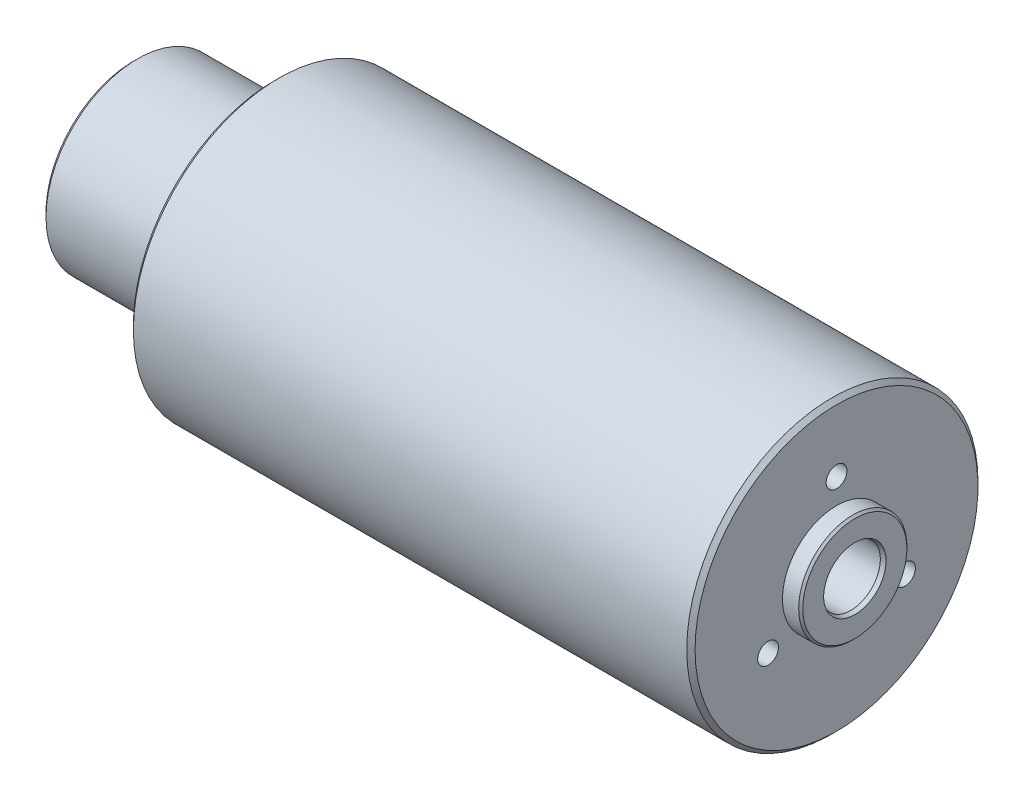
ISO-10303-21;
HEADER;
FILE_DESCRIPTION(('STEP AP214'),'2;1');
FILE_NAME('part.step','',(''),(''),'','','');
FILE_SCHEMA(('AUTOMOTIVE_DESIGN { 1 0 10303 214 1 1 1 1 }'));
ENDSEC;
DATA;
#1=APPLICATION_CONTEXT('core data for automotive mechanical design processes');
#2=APPLICATION_PROTOCOL_DEFINITION('international standard','automotive_design',2000,#1);
#3=PRODUCT_CONTEXT('',#1,'mechanical');
#4=PRODUCT('Part','Part','',(#3));
#5=PRODUCT_RELATED_PRODUCT_CATEGORY('part','',(#4));
#6=PRODUCT_DEFINITION_FORMATION('','',#4);
#7=PRODUCT_DEFINITION_CONTEXT('part definition',#1,'design');
#8=PRODUCT_DEFINITION('design','',#6,#7);
#9=PRODUCT_DEFINITION_SHAPE('','',#8);
#10=(LENGTH_UNIT() NAMED_UNIT(*) SI_UNIT(.MILLI.,.METRE.));
#11=(NAMED_UNIT(*) PLANE_ANGLE_UNIT() SI_UNIT($,.RADIAN.));
#12=(NAMED_UNIT(*) SI_UNIT($,.STERADIAN.) SOLID_ANGLE_UNIT());
#13=UNCERTAINTY_MEASURE_WITH_UNIT(LENGTH_MEASURE(1.E-05),#10,'distance_accuracy_value','');
#14=(GEOMETRIC_REPRESENTATION_CONTEXT(3) GLOBAL_UNCERTAINTY_ASSIGNED_CONTEXT((#13)) GLOBAL_UNIT_ASSIGNED_CONTEXT((#10,
#11,#12)) REPRESENTATION_CONTEXT('',''));
#15=CARTESIAN_POINT('',(0.,0.,0.));
#16=DIRECTION('',(0.,0.,1.));
#17=DIRECTION('',(1.,0.,0.));
#18=AXIS2_PLACEMENT_3D('',#15,#16,#17);
#19=CARTESIAN_POINT('',(-84.5007135035158,11.,0.));
#20=DIRECTION('',(1.,0.,0.));
#21=DIRECTION('',(0.,0.,-1.));
#22=AXIS2_PLACEMENT_3D('',#19,#20,#21);
#23=PLANE('',#22);
#24=CARTESIAN_POINT('',(-84.5007135035158,0.,0.));
#25=DIRECTION('',(1.,0.,0.));
#26=DIRECTION('',(0.,0.,-1.));
#27=AXIS2_PLACEMENT_3D('',#24,#25,#26);
#28=CIRCLE('',#27,10.5);
#29=CARTESIAN_POINT('',(-84.5007135035158,0.,-10.5));
#30=VERTEX_POINT('',#29);
#31=EDGE_CURVE('E117',#30,#30,#28,.F.);
#32=ORIENTED_EDGE('',*,*,#31,.T.);
#33=EDGE_LOOP('',(#32));
#34=FACE_BOUND('',#33,.T.);
#35=ADVANCED_FACE('F32',(#34),#23,.F.);
#36=CARTESIAN_POINT('',(-71.1251521298174,0.,0.));
#37=DIRECTION('',(-1.,0.,0.));
#38=DIRECTION('',(0.,0.,1.));
#39=AXIS2_PLACEMENT_3D('',#36,#37,#38);
#40=CYLINDRICAL_SURFACE('',#39,11.);
#41=CARTESIAN_POINT('',(-84.0007135035158,0.,0.));
#42=DIRECTION('',(1.,0.,0.));
#43=DIRECTION('',(0.,0.,-1.));
#44=AXIS2_PLACEMENT_3D('',#41,#42,#43);
#45=CIRCLE('',#44,11.);
#46=CARTESIAN_POINT('',(-84.0007135035158,0.,-11.));
#47=VERTEX_POINT('',#46);
#48=EDGE_CURVE('E120',#47,#47,#45,.T.);
#49=ORIENTED_EDGE('',*,*,#48,.T.);
#50=EDGE_LOOP('',(#49));
#51=FACE_BOUND('',#50,.T.);
#52=CARTESIAN_POINT('',(-67.5007135035158,0.,0.));
#53=DIRECTION('',(-1.,0.,0.));
#54=DIRECTION('',(0.,0.,1.));
#55=AXIS2_PLACEMENT_3D('',#52,#53,#54);
#56=CIRCLE('',#55,11.);
#57=CARTESIAN_POINT('',(-67.5007135035158,0.,11.));
#58=VERTEX_POINT('',#57);
#59=EDGE_CURVE('E108',#58,#58,#56,.T.);
#60=ORIENTED_EDGE('',*,*,#59,.T.);
#61=EDGE_LOOP('',(#60));
#62=FACE_BOUND('',#61,.T.);
#63=ADVANCED_FACE('F144',(#51,#62),#40,.T.);
#64=CARTESIAN_POINT('',(-67.5007135035158,17.5,0.));
#65=DIRECTION('',(1.,0.,0.));
#66=DIRECTION('',(0.,0.,-1.));
#67=AXIS2_PLACEMENT_3D('',#64,#65,#66);
#68=PLANE('',#67);
#69=CARTESIAN_POINT('',(-67.5007135035158,0.,0.));
#70=DIRECTION('',(1.,0.,0.));
#71=DIRECTION('',(0.,0.,-1.));
#72=AXIS2_PLACEMENT_3D('',#69,#70,#71);
#73=CIRCLE('',#72,17.);
#74=CARTESIAN_POINT('',(-67.5007135035158,0.,-17.));
#75=VERTEX_POINT('',#74);
#76=EDGE_CURVE('E123',#75,#75,#73,.F.);
#77=ORIENTED_EDGE('',*,*,#76,.T.);
#78=EDGE_LOOP('',(#77));
#79=FACE_BOUND('',#78,.T.);
#80=ORIENTED_EDGE('',*,*,#59,.F.);
#81=EDGE_LOOP('',(#80));
#82=FACE_BOUND('',#81,.T.);
#83=ADVANCED_FACE('F141',(#79,#82),#68,.F.);
#84=CARTESIAN_POINT('',(-71.1251521298174,0.,0.));
#85=DIRECTION('',(-1.,0.,0.));
#86=DIRECTION('',(0.,0.,1.));
#87=AXIS2_PLACEMENT_3D('',#84,#85,#86);
#88=CYLINDRICAL_SURFACE('',#87,17.5);
#89=CARTESIAN_POINT('',(-67.0007135035158,0.,0.));
#90=DIRECTION('',(1.,0.,0.));
#91=DIRECTION('',(0.,0.,-1.));
#92=AXIS2_PLACEMENT_3D('',#89,#90,#91);
#93=CIRCLE('',#92,17.5);
#94=CARTESIAN_POINT('',(-67.0007135035158,0.,-17.5));
#95=VERTEX_POINT('',#94);
#96=EDGE_CURVE('E39',#95,#95,#93,.T.);
#97=ORIENTED_EDGE('',*,*,#96,.T.);
#98=EDGE_LOOP('',(#97));
#99=FACE_BOUND('',#98,.T.);
#100=CARTESIAN_POINT('',(-0.5,0.,0.));
#101=DIRECTION('',(-1.,0.,0.));
#102=DIRECTION('',(0.,0.,1.));
#103=AXIS2_PLACEMENT_3D('',#100,#101,#102);
#104=CIRCLE('',#103,17.5);
#105=CARTESIAN_POINT('',(-0.5,0.,17.5));
#106=VERTEX_POINT('',#105);
#107=EDGE_CURVE('E126',#106,#106,#104,.T.);
#108=ORIENTED_EDGE('',*,*,#107,.T.);
#109=EDGE_LOOP('',(#108));
#110=FACE_BOUND('',#109,.T.);
#111=ADVANCED_FACE('F131',(#99,#110),#88,.T.);
#112=CARTESIAN_POINT('',(0.,6.5,0.));
#113=DIRECTION('',(-1.,0.,0.));
#114=DIRECTION('',(0.,0.,1.));
#115=AXIS2_PLACEMENT_3D('',#112,#113,#114);
#116=PLANE('',#115);
#117=CARTESIAN_POINT('',(0.,0.,0.));
#118=DIRECTION('',(-1.,0.,0.));
#119=DIRECTION('',(0.,0.,1.));
#120=AXIS2_PLACEMENT_3D('',#117,#118,#119);
#121=CIRCLE('',#120,17.);
#122=CARTESIAN_POINT('',(0.,0.,17.));
#123=VERTEX_POINT('',#122);
#124=EDGE_CURVE('E11',#123,#123,#121,.F.);
#125=ORIENTED_EDGE('',*,*,#124,.T.);
#126=EDGE_LOOP('',(#125));
#127=FACE_BOUND('',#126,.T.);
#128=CARTESIAN_POINT('',(0.,-4.74999999999992,8.22724133595221));
#129=DIRECTION('',(1.,0.,0.));
#130=DIRECTION('',(0.,0.,-1.));
#131=AXIS2_PLACEMENT_3D('',#128,#129,#130);
#132=CIRCLE('',#131,1.25);
#133=CARTESIAN_POINT('',(0.,-4.74999999999992,6.97724133595221));
#134=VERTEX_POINT('',#133);
#135=EDGE_CURVE('E78',#134,#134,#132,.T.);
#136=ORIENTED_EDGE('',*,*,#135,.F.);
#137=EDGE_LOOP('',(#136));
#138=FACE_BOUND('',#137,.T.);
#139=CARTESIAN_POINT('',(0.,-4.75000000000004,-8.22724133595215));
#140=DIRECTION('',(1.,0.,0.));
#141=DIRECTION('',(0.,0.,-1.));
#142=AXIS2_PLACEMENT_3D('',#139,#140,#141);
#143=CIRCLE('',#142,1.25);
#144=CARTESIAN_POINT('',(0.,-4.75000000000004,-9.47724133595215));
#145=VERTEX_POINT('',#144);
#146=EDGE_CURVE('E90',#145,#145,#143,.T.);
#147=ORIENTED_EDGE('',*,*,#146,.F.);
#148=EDGE_LOOP('',(#147));
#149=FACE_BOUND('',#148,.T.);
#150=CARTESIAN_POINT('',(0.,9.5,0.));
#151=DIRECTION('',(1.,0.,0.));
#152=DIRECTION('',(0.,0.,-1.));
#153=AXIS2_PLACEMENT_3D('',#150,#151,#152);
#154=CIRCLE('',#153,1.25);
#155=CARTESIAN_POINT('',(0.,9.5,-1.25));
#156=VERTEX_POINT('',#155);
#157=EDGE_CURVE('E102',#156,#156,#154,.T.);
#158=ORIENTED_EDGE('',*,*,#157,.F.);
#159=EDGE_LOOP('',(#158));
#160=FACE_BOUND('',#159,.T.);
#161=CARTESIAN_POINT('',(0.,0.,0.));
#162=DIRECTION('',(-1.,0.,0.));
#163=DIRECTION('',(0.,0.,1.));
#164=AXIS2_PLACEMENT_3D('',#161,#162,#163);
#165=CIRCLE('',#164,6.5);
#166=CARTESIAN_POINT('',(0.,0.,6.5));
#167=VERTEX_POINT('',#166);
#168=EDGE_CURVE('E105',#167,#167,#165,.T.);
#169=ORIENTED_EDGE('',*,*,#168,.T.);
#170=EDGE_LOOP('',(#169));
#171=FACE_BOUND('',#170,.T.);
#172=ADVANCED_FACE('F157',(#127,#138,#149,#160,#171),#116,.F.);
#173=CARTESIAN_POINT('',(-71.1251521298174,0.,0.));
#174=DIRECTION('',(-1.,0.,0.));
#175=DIRECTION('',(0.,0.,1.));
#176=AXIS2_PLACEMENT_3D('',#173,#174,#175);
#177=CYLINDRICAL_SURFACE('',#176,6.5);
#178=CARTESIAN_POINT('',(1.95000000000001,0.,0.));
#179=DIRECTION('',(-1.,0.,0.));
#180=DIRECTION('',(0.,0.,1.));
#181=AXIS2_PLACEMENT_3D('',#178,#179,#180);
#182=CIRCLE('',#181,6.5);
#183=CARTESIAN_POINT('',(1.95000000000001,0.,6.5));
#184=VERTEX_POINT('',#183);
#185=EDGE_CURVE('E111',#184,#184,#182,.T.);
#186=ORIENTED_EDGE('',*,*,#185,.T.);
#187=EDGE_LOOP('',(#186));
#188=FACE_BOUND('',#187,.T.);
#189=ORIENTED_EDGE('',*,*,#168,.F.);
#190=EDGE_LOOP('',(#189));
#191=FACE_BOUND('',#190,.T.);
#192=ADVANCED_FACE('F160',(#188,#191),#177,.T.);
#193=CARTESIAN_POINT('',(2.2,0.,0.));
#194=DIRECTION('',(-1.,0.,0.));
#195=DIRECTION('',(0.,0.,1.));
#196=AXIS2_PLACEMENT_3D('',#193,#194,#195);
#197=PLANE('',#196);
#198=CARTESIAN_POINT('',(2.2,0.,0.));
#199=DIRECTION('',(1.,0.,0.));
#200=DIRECTION('',(0.,0.,-1.));
#201=AXIS2_PLACEMENT_3D('',#198,#199,#200);
#202=CIRCLE('',#201,3.75);
#203=CARTESIAN_POINT('',(2.2,0.,-3.75));
#204=VERTEX_POINT('',#203);
#205=EDGE_CURVE('E69',#204,#204,#202,.T.);
#206=ORIENTED_EDGE('',*,*,#205,.F.);
#207=EDGE_LOOP('',(#206));
#208=FACE_BOUND('',#207,.T.);
#209=CARTESIAN_POINT('',(2.2,0.,0.));
#210=DIRECTION('',(-1.,0.,0.));
#211=DIRECTION('',(0.,0.,1.));
#212=AXIS2_PLACEMENT_3D('',#209,#210,#211);
#213=CIRCLE('',#212,6.25000000000001);
#214=CARTESIAN_POINT('',(2.2,0.,6.25000000000001));
#215=VERTEX_POINT('',#214);
#216=EDGE_CURVE('E114',#215,#215,#213,.F.);
#217=ORIENTED_EDGE('',*,*,#216,.T.);
#218=EDGE_LOOP('',(#217));
#219=FACE_BOUND('',#218,.T.);
#220=ADVANCED_FACE('F164',(#208,#219),#197,.F.);
#221=CARTESIAN_POINT('',(1.95000000000001,0.,0.));
#222=DIRECTION('',(-1.,0.,0.));
#223=DIRECTION('',(0.,0.,1.));
#224=AXIS2_PLACEMENT_3D('',#221,#222,#223);
#225=CONICAL_SURFACE('',#224,6.5,0.78539816339744);
#226=ORIENTED_EDGE('',*,*,#216,.F.);
#227=EDGE_LOOP('',(#226));
#228=FACE_BOUND('',#227,.T.);
#229=ORIENTED_EDGE('',*,*,#185,.F.);
#230=EDGE_LOOP('',(#229));
#231=FACE_BOUND('',#230,.T.);
#232=ADVANCED_FACE('F168',(#228,#231),#225,.T.);
#233=CARTESIAN_POINT('',(0.,9.5,0.));
#234=DIRECTION('',(1.,0.,0.));
#235=DIRECTION('',(0.,0.,-1.));
#236=AXIS2_PLACEMENT_3D('',#233,#234,#235);
#237=CYLINDRICAL_SURFACE('',#236,1.25);
#238=CARTESIAN_POINT('',(-4.5,9.5,0.));
#239=DIRECTION('',(1.,0.,0.));
#240=DIRECTION('',(0.,0.,-1.));
#241=AXIS2_PLACEMENT_3D('',#238,#239,#240);
#242=CIRCLE('',#241,1.25);
#243=CARTESIAN_POINT('',(-4.5,9.5,-1.25));
#244=VERTEX_POINT('',#243);
#245=EDGE_CURVE('E99',#244,#244,#242,.T.);
#246=ORIENTED_EDGE('',*,*,#245,.F.);
#247=EDGE_LOOP('',(#246));
#248=FACE_BOUND('',#247,.T.);
#249=ORIENTED_EDGE('',*,*,#157,.T.);
#250=EDGE_LOOP('',(#249));
#251=FACE_BOUND('',#250,.T.);
#252=ADVANCED_FACE('F172',(#248,#251),#237,.F.);
#253=CARTESIAN_POINT('',(-4.5,10.525,0.));
#254=DIRECTION('',(-1.,0.,0.));
#255=DIRECTION('',(0.,0.,1.));
#256=AXIS2_PLACEMENT_3D('',#253,#254,#255);
#257=PLANE('',#256);
#258=CARTESIAN_POINT('',(-4.5,9.5,0.));
#259=DIRECTION('',(1.,0.,0.));
#260=DIRECTION('',(0.,0.,-1.));
#261=AXIS2_PLACEMENT_3D('',#258,#259,#260);
#262=CIRCLE('',#261,1.025);
#263=CARTESIAN_POINT('',(-4.5,9.5,-1.025));
#264=VERTEX_POINT('',#263);
#265=EDGE_CURVE('E96',#264,#264,#262,.T.);
#266=ORIENTED_EDGE('',*,*,#265,.F.);
#267=EDGE_LOOP('',(#266));
#268=FACE_BOUND('',#267,.T.);
#269=ORIENTED_EDGE('',*,*,#245,.T.);
#270=EDGE_LOOP('',(#269));
#271=FACE_BOUND('',#270,.T.);
#272=ADVANCED_FACE('F176',(#268,#271),#257,.F.);
#273=CARTESIAN_POINT('',(0.,9.5,0.));
#274=DIRECTION('',(1.,0.,0.));
#275=DIRECTION('',(0.,0.,-1.));
#276=AXIS2_PLACEMENT_3D('',#273,#274,#275);
#277=CYLINDRICAL_SURFACE('',#276,1.025);
#278=CARTESIAN_POINT('',(-6.75,9.5,0.));
#279=DIRECTION('',(1.,0.,0.));
#280=DIRECTION('',(0.,0.,-1.));
#281=AXIS2_PLACEMENT_3D('',#278,#279,#280);
#282=CIRCLE('',#281,1.025);
#283=CARTESIAN_POINT('',(-6.75,9.5,-1.025));
#284=VERTEX_POINT('',#283);
#285=EDGE_CURVE('E93',#284,#284,#282,.T.);
#286=ORIENTED_EDGE('',*,*,#285,.F.);
#287=EDGE_LOOP('',(#286));
#288=FACE_BOUND('',#287,.T.);
#289=ORIENTED_EDGE('',*,*,#265,.T.);
#290=EDGE_LOOP('',(#289));
#291=FACE_BOUND('',#290,.T.);
#292=ADVANCED_FACE('F180',(#288,#291),#277,.F.);
#293=CARTESIAN_POINT('',(-6.75,9.5,0.));
#294=DIRECTION('',(1.,0.,0.));
#295=DIRECTION('',(0.,0.,-1.));
#296=AXIS2_PLACEMENT_3D('',#293,#294,#295);
#297=CONICAL_SURFACE('',#296,1.025,1.02974425867665);
#298=CARTESIAN_POINT('',(-7.36588213450325,9.5,0.));
#299=VERTEX_POINT('',#298);
#300=VERTEX_LOOP('',#299);
#301=FACE_BOUND('',#300,.T.);
#302=ORIENTED_EDGE('',*,*,#285,.T.);
#303=EDGE_LOOP('',(#302));
#304=FACE_BOUND('',#303,.T.);
#305=ADVANCED_FACE('F184',(#301,#304),#297,.F.);
#306=CARTESIAN_POINT('',(0.,-4.75000000000004,-8.22724133595215));
#307=DIRECTION('',(1.,0.,0.));
#308=DIRECTION('',(0.,0.,-1.));
#309=AXIS2_PLACEMENT_3D('',#306,#307,#308);
#310=CYLINDRICAL_SURFACE('',#309,1.25);
#311=CARTESIAN_POINT('',(-4.5,-4.75000000000004,-8.22724133595215));
#312=DIRECTION('',(1.,0.,0.));
#313=DIRECTION('',(0.,0.,-1.));
#314=AXIS2_PLACEMENT_3D('',#311,#312,#313);
#315=CIRCLE('',#314,1.25);
#316=CARTESIAN_POINT('',(-4.5,-4.75000000000004,-9.47724133595215));
#317=VERTEX_POINT('',#316);
#318=EDGE_CURVE('E87',#317,#317,#315,.T.);
#319=ORIENTED_EDGE('',*,*,#318,.F.);
#320=EDGE_LOOP('',(#319));
#321=FACE_BOUND('',#320,.T.);
#322=ORIENTED_EDGE('',*,*,#146,.T.);
#323=EDGE_LOOP('',(#322));
#324=FACE_BOUND('',#323,.T.);
#325=ADVANCED_FACE('F188',(#321,#324),#310,.F.);
#326=CARTESIAN_POINT('',(-4.5,-3.72500000000004,-8.22724133595215));
#327=DIRECTION('',(-1.,0.,0.));
#328=DIRECTION('',(0.,0.,1.));
#329=AXIS2_PLACEMENT_3D('',#326,#327,#328);
#330=PLANE('',#329);
#331=CARTESIAN_POINT('',(-4.5,-4.75000000000004,-8.22724133595215));
#332=DIRECTION('',(1.,0.,0.));
#333=DIRECTION('',(0.,0.,-1.));
#334=AXIS2_PLACEMENT_3D('',#331,#332,#333);
#335=CIRCLE('',#334,1.025);
#336=CARTESIAN_POINT('',(-4.5,-4.75000000000004,-9.25224133595214));
#337=VERTEX_POINT('',#336);
#338=EDGE_CURVE('E84',#337,#337,#335,.T.);
#339=ORIENTED_EDGE('',*,*,#338,.F.);
#340=EDGE_LOOP('',(#339));
#341=FACE_BOUND('',#340,.T.);
#342=ORIENTED_EDGE('',*,*,#318,.T.);
#343=EDGE_LOOP('',(#342));
#344=FACE_BOUND('',#343,.T.);
#345=ADVANCED_FACE('F191',(#341,#344),#330,.F.);
#346=CARTESIAN_POINT('',(0.,-4.75000000000004,-8.22724133595215));
#347=DIRECTION('',(1.,0.,0.));
#348=DIRECTION('',(0.,0.,-1.));
#349=AXIS2_PLACEMENT_3D('',#346,#347,#348);
#350=CYLINDRICAL_SURFACE('',#349,1.025);
#351=CARTESIAN_POINT('',(-6.75,-4.75000000000004,-8.22724133595215));
#352=DIRECTION('',(1.,0.,0.));
#353=DIRECTION('',(0.,0.,-1.));
#354=AXIS2_PLACEMENT_3D('',#351,#352,#353);
#355=CIRCLE('',#354,1.025);
#356=CARTESIAN_POINT('',(-6.75,-4.75000000000004,-9.25224133595214));
#357=VERTEX_POINT('',#356);
#358=EDGE_CURVE('E81',#357,#357,#355,.T.);
#359=ORIENTED_EDGE('',*,*,#358,.F.);
#360=EDGE_LOOP('',(#359));
#361=FACE_BOUND('',#360,.T.);
#362=ORIENTED_EDGE('',*,*,#338,.T.);
#363=EDGE_LOOP('',(#362));
#364=FACE_BOUND('',#363,.T.);
#365=ADVANCED_FACE('F195',(#361,#364),#350,.F.);
#366=CARTESIAN_POINT('',(-6.75,-4.75000000000004,-8.22724133595215));
#367=DIRECTION('',(1.,0.,0.));
#368=DIRECTION('',(0.,0.,-1.));
#369=AXIS2_PLACEMENT_3D('',#366,#367,#368);
#370=CONICAL_SURFACE('',#369,1.025,1.02974425867665);
#371=CARTESIAN_POINT('',(-7.36588213450325,-4.75000000000004,-8.22724133595215));
#372=VERTEX_POINT('',#371);
#373=VERTEX_LOOP('',#372);
#374=FACE_BOUND('',#373,.T.);
#375=ORIENTED_EDGE('',*,*,#358,.T.);
#376=EDGE_LOOP('',(#375));
#377=FACE_BOUND('',#376,.T.);
#378=ADVANCED_FACE('F199',(#374,#377),#370,.F.);
#379=CARTESIAN_POINT('',(0.,-4.74999999999992,8.22724133595221));
#380=DIRECTION('',(1.,0.,0.));
#381=DIRECTION('',(0.,0.,-1.));
#382=AXIS2_PLACEMENT_3D('',#379,#380,#381);
#383=CYLINDRICAL_SURFACE('',#382,1.25);
#384=CARTESIAN_POINT('',(-4.5,-4.74999999999992,8.22724133595221));
#385=DIRECTION('',(1.,0.,0.));
#386=DIRECTION('',(0.,0.,-1.));
#387=AXIS2_PLACEMENT_3D('',#384,#385,#386);
#388=CIRCLE('',#387,1.25);
#389=CARTESIAN_POINT('',(-4.5,-4.74999999999992,6.97724133595221));
#390=VERTEX_POINT('',#389);
#391=EDGE_CURVE('E75',#390,#390,#388,.T.);
#392=ORIENTED_EDGE('',*,*,#391,.F.);
#393=EDGE_LOOP('',(#392));
#394=FACE_BOUND('',#393,.T.);
#395=ORIENTED_EDGE('',*,*,#135,.T.);
#396=EDGE_LOOP('',(#395));
#397=FACE_BOUND('',#396,.T.);
#398=ADVANCED_FACE('F203',(#394,#397),#383,.F.);
#399=CARTESIAN_POINT('',(-4.5,-3.72499999999993,8.22724133595221));
#400=DIRECTION('',(-1.,0.,0.));
#401=DIRECTION('',(0.,0.,1.));
#402=AXIS2_PLACEMENT_3D('',#399,#400,#401);
#403=PLANE('',#402);
#404=CARTESIAN_POINT('',(-4.5,-4.74999999999992,8.22724133595221));
#405=DIRECTION('',(1.,0.,0.));
#406=DIRECTION('',(0.,0.,-1.));
#407=AXIS2_PLACEMENT_3D('',#404,#405,#406);
#408=CIRCLE('',#407,1.025);
#409=CARTESIAN_POINT('',(-4.5,-4.74999999999992,7.20224133595221));
#410=VERTEX_POINT('',#409);
#411=EDGE_CURVE('E66',#410,#410,#408,.T.);
#412=ORIENTED_EDGE('',*,*,#411,.F.);
#413=EDGE_LOOP('',(#412));
#414=FACE_BOUND('',#413,.T.);
#415=ORIENTED_EDGE('',*,*,#391,.T.);
#416=EDGE_LOOP('',(#415));
#417=FACE_BOUND('',#416,.T.);
#418=ADVANCED_FACE('F206',(#414,#417),#403,.F.);
#419=CARTESIAN_POINT('',(0.,-4.74999999999992,8.22724133595221));
#420=DIRECTION('',(1.,0.,0.));
#421=DIRECTION('',(0.,0.,-1.));
#422=AXIS2_PLACEMENT_3D('',#419,#420,#421);
#423=CYLINDRICAL_SURFACE('',#422,1.025);
#424=CARTESIAN_POINT('',(-6.75,-4.74999999999992,8.22724133595221));
#425=DIRECTION('',(1.,0.,0.));
#426=DIRECTION('',(0.,0.,-1.));
#427=AXIS2_PLACEMENT_3D('',#424,#425,#426);
#428=CIRCLE('',#427,1.025);
#429=CARTESIAN_POINT('',(-6.75,-4.74999999999992,7.20224133595221));
#430=VERTEX_POINT('',#429);
#431=EDGE_CURVE('E62',#430,#430,#428,.T.);
#432=ORIENTED_EDGE('',*,*,#431,.F.);
#433=EDGE_LOOP('',(#432));
#434=FACE_BOUND('',#433,.T.);
#435=ORIENTED_EDGE('',*,*,#411,.T.);
#436=EDGE_LOOP('',(#435));
#437=FACE_BOUND('',#436,.T.);
#438=ADVANCED_FACE('F210',(#434,#437),#423,.F.);
#439=CARTESIAN_POINT('',(-6.75,-4.74999999999992,8.22724133595221));
#440=DIRECTION('',(1.,0.,0.));
#441=DIRECTION('',(0.,0.,-1.));
#442=AXIS2_PLACEMENT_3D('',#439,#440,#441);
#443=CONICAL_SURFACE('',#442,1.025,1.02974425867665);
#444=CARTESIAN_POINT('',(-7.36588213450325,-4.74999999999993,8.22724133595221));
#445=VERTEX_POINT('',#444);
#446=VERTEX_LOOP('',#445);
#447=FACE_BOUND('',#446,.T.);
#448=ORIENTED_EDGE('',*,*,#431,.T.);
#449=EDGE_LOOP('',(#448));
#450=FACE_BOUND('',#449,.T.);
#451=ADVANCED_FACE('F214',(#447,#450),#443,.F.);
#452=CARTESIAN_POINT('',(-84.5007135035158,0.,0.));
#453=DIRECTION('',(1.,0.,0.));
#454=DIRECTION('',(0.,0.,-1.));
#455=AXIS2_PLACEMENT_3D('',#452,#453,#454);
#456=CONICAL_SURFACE('',#455,10.5,0.785398163397448);
#457=ORIENTED_EDGE('',*,*,#48,.F.);
#458=EDGE_LOOP('',(#457));
#459=FACE_BOUND('',#458,.T.);
#460=ORIENTED_EDGE('',*,*,#31,.F.);
#461=EDGE_LOOP('',(#460));
#462=FACE_BOUND('',#461,.T.);
#463=ADVANCED_FACE('F137',(#459,#462),#456,.T.);
#464=CARTESIAN_POINT('',(-67.5007135035158,0.,0.));
#465=DIRECTION('',(1.,0.,0.));
#466=DIRECTION('',(0.,0.,-1.));
#467=AXIS2_PLACEMENT_3D('',#464,#465,#466);
#468=CONICAL_SURFACE('',#467,17.,0.785398163397438);
#469=ORIENTED_EDGE('',*,*,#96,.F.);
#470=EDGE_LOOP('',(#469));
#471=FACE_BOUND('',#470,.T.);
#472=ORIENTED_EDGE('',*,*,#76,.F.);
#473=EDGE_LOOP('',(#472));
#474=FACE_BOUND('',#473,.T.);
#475=ADVANCED_FACE('F134',(#471,#474),#468,.T.);
#476=CARTESIAN_POINT('',(-0.5,0.,0.));
#477=DIRECTION('',(-1.,0.,0.));
#478=DIRECTION('',(0.,0.,1.));
#479=AXIS2_PLACEMENT_3D('',#476,#477,#478);
#480=CONICAL_SURFACE('',#479,17.5,0.785398163397448);
#481=ORIENTED_EDGE('',*,*,#124,.F.);
#482=EDGE_LOOP('',(#481));
#483=FACE_BOUND('',#482,.T.);
#484=ORIENTED_EDGE('',*,*,#107,.F.);
#485=EDGE_LOOP('',(#484));
#486=FACE_BOUND('',#485,.T.);
#487=ADVANCED_FACE('F56',(#483,#486),#480,.T.);
#488=CARTESIAN_POINT('',(-17.8,0.,0.));
#489=DIRECTION('',(1.,0.,0.));
#490=DIRECTION('',(0.,0.,-1.));
#491=AXIS2_PLACEMENT_3D('',#488,#489,#490);
#492=CONICAL_SURFACE('',#491,3.54999999999999,1.02974425867665);
#493=CARTESIAN_POINT('',(-19.9330551975478,0.,0.));
#494=VERTEX_POINT('',#493);
#495=VERTEX_LOOP('',#494);
#496=FACE_BOUND('',#495,.T.);
#497=CARTESIAN_POINT('',(-17.8,0.,0.));
#498=DIRECTION('',(1.,0.,0.));
#499=DIRECTION('',(0.,0.,-1.));
#500=AXIS2_PLACEMENT_3D('',#497,#498,#499);
#501=CIRCLE('',#500,3.54999999999999);
#502=CARTESIAN_POINT('',(-17.8,0.,-3.54999999999999));
#503=VERTEX_POINT('',#502);
#504=EDGE_CURVE('E60',#503,#503,#501,.T.);
#505=ORIENTED_EDGE('',*,*,#504,.T.);
#506=EDGE_LOOP('',(#505));
#507=FACE_BOUND('',#506,.T.);
#508=ADVANCED_FACE('F52',(#496,#507),#492,.F.);
#509=CARTESIAN_POINT('',(2.2,0.,0.));
#510=DIRECTION('',(1.,0.,0.));
#511=DIRECTION('',(0.,0.,-1.));
#512=AXIS2_PLACEMENT_3D('',#509,#510,#511);
#513=CYLINDRICAL_SURFACE('',#512,3.54999999999999);
#514=ORIENTED_EDGE('',*,*,#504,.F.);
#515=EDGE_LOOP('',(#514));
#516=FACE_BOUND('',#515,.T.);
#517=CARTESIAN_POINT('',(1.71715728752538,0.,0.));
#518=DIRECTION('',(1.,0.,0.));
#519=DIRECTION('',(0.,0.,-1.));
#520=AXIS2_PLACEMENT_3D('',#517,#518,#519);
#521=CIRCLE('',#520,3.55);
#522=CARTESIAN_POINT('',(1.71715728752538,0.,-3.55));
#523=VERTEX_POINT('',#522);
#524=EDGE_CURVE('E63',#523,#523,#521,.T.);
#525=ORIENTED_EDGE('',*,*,#524,.T.);
#526=EDGE_LOOP('',(#525));
#527=FACE_BOUND('',#526,.T.);
#528=ADVANCED_FACE('F55',(#516,#527),#513,.F.);
#529=CARTESIAN_POINT('',(2.2,0.,0.));
#530=DIRECTION('',(1.,0.,0.));
#531=DIRECTION('',(0.,0.,-1.));
#532=AXIS2_PLACEMENT_3D('',#529,#530,#531);
#533=CONICAL_SURFACE('',#532,3.75,0.392699081698728);
#534=ORIENTED_EDGE('',*,*,#524,.F.);
#535=EDGE_LOOP('',(#534));
#536=FACE_BOUND('',#535,.T.);
#537=ORIENTED_EDGE('',*,*,#205,.T.);
#538=EDGE_LOOP('',(#537));
#539=FACE_BOUND('',#538,.T.);
#540=ADVANCED_FACE('F227',(#536,#539),#533,.F.);
#541=CLOSED_SHELL('',(#35,#63,#83,#111,#172,#192,#220,#232,#252,#272,#292,#305,#325,#345,#365,
#378,#398,#418,#438,#451,#463,#475,#487,#508,#528,#540));
#542=MANIFOLD_SOLID_BREP('B2',#541);
#543=ADVANCED_BREP_SHAPE_REPRESENTATION('',(#18,#542),#14);
#544=SHAPE_DEFINITION_REPRESENTATION(#9,#543);
ENDSEC;
END-ISO-10303-21;
